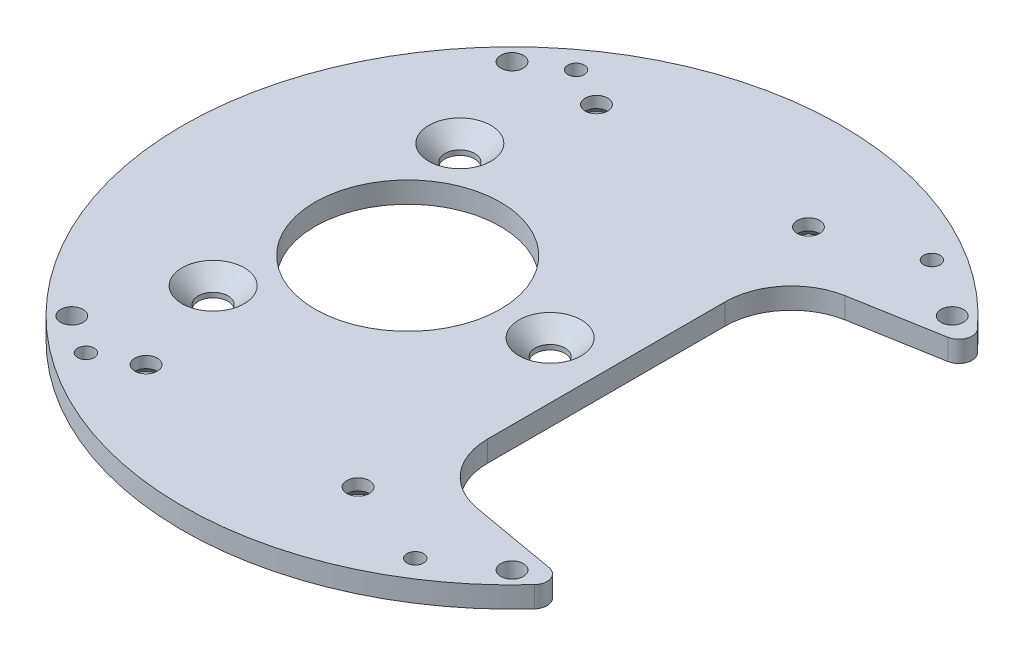
ISO-10303-21;
HEADER;
FILE_DESCRIPTION(('STEP AP214'),'2;1');
FILE_NAME('part.step','',(''),(''),'','','');
FILE_SCHEMA(('AUTOMOTIVE_DESIGN { 1 0 10303 214 1 1 1 1 }'));
ENDSEC;
DATA;
#1=APPLICATION_CONTEXT('core data for automotive mechanical design processes');
#2=APPLICATION_PROTOCOL_DEFINITION('international standard','automotive_design',2000,#1);
#3=PRODUCT_CONTEXT('',#1,'mechanical');
#4=PRODUCT('Part','Part','',(#3));
#5=PRODUCT_RELATED_PRODUCT_CATEGORY('part','',(#4));
#6=PRODUCT_DEFINITION_FORMATION('','',#4);
#7=PRODUCT_DEFINITION_CONTEXT('part definition',#1,'design');
#8=PRODUCT_DEFINITION('design','',#6,#7);
#9=PRODUCT_DEFINITION_SHAPE('','',#8);
#10=(LENGTH_UNIT() NAMED_UNIT(*) SI_UNIT(.MILLI.,.METRE.));
#11=(NAMED_UNIT(*) PLANE_ANGLE_UNIT() SI_UNIT($,.RADIAN.));
#12=(NAMED_UNIT(*) SI_UNIT($,.STERADIAN.) SOLID_ANGLE_UNIT());
#13=UNCERTAINTY_MEASURE_WITH_UNIT(LENGTH_MEASURE(1.E-05),#10,'distance_accuracy_value','');
#14=(GEOMETRIC_REPRESENTATION_CONTEXT(3) GLOBAL_UNCERTAINTY_ASSIGNED_CONTEXT((#13)) GLOBAL_UNIT_ASSIGNED_CONTEXT((#10,
#11,#12)) REPRESENTATION_CONTEXT('',''));
#15=CARTESIAN_POINT('',(0.,0.,0.));
#16=DIRECTION('',(0.,0.,1.));
#17=DIRECTION('',(1.,0.,0.));
#18=AXIS2_PLACEMENT_3D('',#15,#16,#17);
#19=CARTESIAN_POINT('',(0.,3.17499999999998,0.));
#20=DIRECTION('',(0.,1.,0.));
#21=DIRECTION('',(0.,0.,1.));
#22=AXIS2_PLACEMENT_3D('',#19,#20,#21);
#23=PLANE('',#22);
#24=CARTESIAN_POINT('',(-27.3313007374329,3.17499999999998,37.));
#25=DIRECTION('',(0.,1.,0.));
#26=DIRECTION('',(0.,0.,1.));
#27=AXIS2_PLACEMENT_3D('',#24,#25,#26);
#28=CIRCLE('',#27,1.24999999999999);
#29=CARTESIAN_POINT('',(-27.3313007374329,3.17499999999998,38.25));
#30=VERTEX_POINT('',#29);
#31=EDGE_CURVE('E354',#30,#30,#28,.T.);
#32=ORIENTED_EDGE('',*,*,#31,.F.);
#33=EDGE_LOOP('',(#32));
#34=FACE_BOUND('',#33,.T.);
#35=CARTESIAN_POINT('',(24.3926218353009,3.17499999999998,39.));
#36=DIRECTION('',(0.,1.,0.));
#37=DIRECTION('',(0.,0.,1.));
#38=AXIS2_PLACEMENT_3D('',#35,#36,#37);
#39=CIRCLE('',#38,1.24999999999999);
#40=CARTESIAN_POINT('',(24.3926218353009,3.17499999999998,40.25));
#41=VERTEX_POINT('',#40);
#42=EDGE_CURVE('E350',#41,#41,#39,.T.);
#43=ORIENTED_EDGE('',*,*,#42,.F.);
#44=EDGE_LOOP('',(#43));
#45=FACE_BOUND('',#44,.T.);
#46=CARTESIAN_POINT('',(24.3926218353009,3.17500000000004,-39.));
#47=DIRECTION('',(0.,1.,0.));
#48=DIRECTION('',(0.,0.,1.));
#49=AXIS2_PLACEMENT_3D('',#46,#47,#48);
#50=CIRCLE('',#49,1.24999999999999);
#51=CARTESIAN_POINT('',(24.3926218353009,3.17500000000004,-37.7500000000001));
#52=VERTEX_POINT('',#51);
#53=EDGE_CURVE('E346',#52,#52,#50,.T.);
#54=ORIENTED_EDGE('',*,*,#53,.F.);
#55=EDGE_LOOP('',(#54));
#56=FACE_BOUND('',#55,.T.);
#57=CARTESIAN_POINT('',(-27.3313007374329,3.17499999999998,-37.));
#58=DIRECTION('',(0.,1.,0.));
#59=DIRECTION('',(0.,0.,1.));
#60=AXIS2_PLACEMENT_3D('',#57,#58,#59);
#61=CIRCLE('',#60,1.24999999999999);
#62=CARTESIAN_POINT('',(-27.3313007374329,3.17499999999998,-35.75));
#63=VERTEX_POINT('',#62);
#64=EDGE_CURVE('E342',#63,#63,#61,.T.);
#65=ORIENTED_EDGE('',*,*,#64,.F.);
#66=EDGE_LOOP('',(#65));
#67=FACE_BOUND('',#66,.T.);
#68=CARTESIAN_POINT('',(-21.25,3.17499999999998,34.));
#69=DIRECTION('',(0.,-1.,0.));
#70=DIRECTION('',(0.,0.,-1.));
#71=AXIS2_PLACEMENT_3D('',#68,#69,#70);
#72=CIRCLE('',#71,1.7);
#73=CARTESIAN_POINT('',(-21.25,3.17499999999998,32.3));
#74=VERTEX_POINT('',#73);
#75=EDGE_CURVE('E334',#74,#74,#72,.T.);
#76=ORIENTED_EDGE('',*,*,#75,.T.);
#77=EDGE_LOOP('',(#76));
#78=FACE_BOUND('',#77,.T.);
#79=CARTESIAN_POINT('',(10.75,3.17499999999998,34.));
#80=DIRECTION('',(0.,-1.,0.));
#81=DIRECTION('',(0.,0.,-1.));
#82=AXIS2_PLACEMENT_3D('',#79,#80,#81);
#83=CIRCLE('',#82,1.7);
#84=CARTESIAN_POINT('',(10.75,3.17499999999998,32.3));
#85=VERTEX_POINT('',#84);
#86=EDGE_CURVE('E327',#85,#85,#83,.T.);
#87=ORIENTED_EDGE('',*,*,#86,.T.);
#88=EDGE_LOOP('',(#87));
#89=FACE_BOUND('',#88,.T.);
#90=CARTESIAN_POINT('',(10.75,3.17499999999998,-34.));
#91=DIRECTION('',(0.,-1.,0.));
#92=DIRECTION('',(0.,0.,-1.));
#93=AXIS2_PLACEMENT_3D('',#90,#91,#92);
#94=CIRCLE('',#93,1.7);
#95=CARTESIAN_POINT('',(10.75,3.17499999999998,-35.7));
#96=VERTEX_POINT('',#95);
#97=EDGE_CURVE('E320',#96,#96,#94,.T.);
#98=ORIENTED_EDGE('',*,*,#97,.T.);
#99=EDGE_LOOP('',(#98));
#100=FACE_BOUND('',#99,.T.);
#101=CARTESIAN_POINT('',(-21.25,3.17499999999998,-34.));
#102=DIRECTION('',(0.,-1.,0.));
#103=DIRECTION('',(0.,0.,-1.));
#104=AXIS2_PLACEMENT_3D('',#101,#102,#103);
#105=CIRCLE('',#104,1.7);
#106=CARTESIAN_POINT('',(-21.25,3.17499999999998,-35.7));
#107=VERTEX_POINT('',#106);
#108=EDGE_CURVE('E313',#107,#107,#105,.T.);
#109=ORIENTED_EDGE('',*,*,#108,.T.);
#110=EDGE_LOOP('',(#109));
#111=FACE_BOUND('',#110,.T.);
#112=CARTESIAN_POINT('',(33.2269476479563,3.17499999999998,33.2269476479555));
#113=DIRECTION('',(0.,-1.,0.));
#114=DIRECTION('',(0.,0.,-1.));
#115=AXIS2_PLACEMENT_3D('',#112,#113,#114);
#116=CIRCLE('',#115,1.7);
#117=CARTESIAN_POINT('',(33.2269476479563,3.17499999999998,31.5269476479555));
#118=VERTEX_POINT('',#117);
#119=EDGE_CURVE('E309',#118,#118,#116,.T.);
#120=ORIENTED_EDGE('',*,*,#119,.T.);
#121=EDGE_LOOP('',(#120));
#122=FACE_BOUND('',#121,.T.);
#123=CARTESIAN_POINT('',(0.,3.17499999999998,0.));
#124=DIRECTION('',(0.,1.,0.));
#125=DIRECTION('',(0.,0.,1.));
#126=AXIS2_PLACEMENT_3D('',#123,#124,#125);
#127=CIRCLE('',#126,49.75);
#128=CARTESIAN_POINT('',(36.8488126440813,3.17500000000004,-33.4249533540647));
#129=VERTEX_POINT('',#128);
#130=CARTESIAN_POINT('',(36.8488126440813,3.17499999999998,33.4249533540646));
#131=VERTEX_POINT('',#130);
#132=EDGE_CURVE('E108',#129,#131,#127,.T.);
#133=ORIENTED_EDGE('',*,*,#132,.T.);
#134=CARTESIAN_POINT('',(35.3674533418067,3.17499999999998,32.0812366363133));
#135=DIRECTION('',(0.,1.,0.));
#136=DIRECTION('',(0.,0.,1.));
#137=AXIS2_PLACEMENT_3D('',#134,#135,#136);
#138=CIRCLE('',#137,2.);
#139=CARTESIAN_POINT('',(35.7147496971405,3.17500000000004,30.1116211302889));
#140=VERTEX_POINT('',#139);
#141=EDGE_CURVE('E130',#131,#140,#138,.T.);
#142=ORIENTED_EDGE('',*,*,#141,.T.);
#143=DIRECTION('',(0.984807753012208,0.,0.173648177666933));
#144=VECTOR('',#143,1.);
#145=CARTESIAN_POINT('',(-4.07245901061396,3.17500000000004,23.0960627480329));
#146=LINE('',#145,#144);
#147=CARTESIAN_POINT('',(22.5135182233307,3.17500000000004,27.7838878428784));
#148=VERTEX_POINT('',#147);
#149=EDGE_CURVE('E154',#148,#140,#146,.T.);
#150=ORIENTED_EDGE('',*,*,#149,.F.);
#151=CARTESIAN_POINT('',(24.25,3.17499999999998,17.9358103127563));
#152=DIRECTION('',(0.,1.,0.));
#153=DIRECTION('',(0.,0.,1.));
#154=AXIS2_PLACEMENT_3D('',#151,#152,#153);
#155=CIRCLE('',#154,10.);
#156=CARTESIAN_POINT('',(14.25,3.17499999999993,17.9358103127563));
#157=VERTEX_POINT('',#156);
#158=EDGE_CURVE('E44',#148,#157,#155,.F.);
#159=ORIENTED_EDGE('',*,*,#158,.T.);
#160=DIRECTION('',(0.,0.,1.));
#161=VECTOR('',#160,1.);
#162=CARTESIAN_POINT('',(14.25,3.17499999999998,0.));
#163=LINE('',#162,#161);
#164=CARTESIAN_POINT('',(14.25,3.17499999999998,-17.9358103127563));
#165=VERTEX_POINT('',#164);
#166=EDGE_CURVE('E152',#165,#157,#163,.T.);
#167=ORIENTED_EDGE('',*,*,#166,.F.);
#168=CARTESIAN_POINT('',(24.25,3.17499999999998,-17.9358103127563));
#169=DIRECTION('',(0.,1.,0.));
#170=DIRECTION('',(0.,0.,1.));
#171=AXIS2_PLACEMENT_3D('',#168,#169,#170);
#172=CIRCLE('',#171,10.);
#173=CARTESIAN_POINT('',(22.5135182233307,3.17499999999998,-27.7838878428784));
#174=VERTEX_POINT('',#173);
#175=EDGE_CURVE('E144',#165,#174,#172,.F.);
#176=ORIENTED_EDGE('',*,*,#175,.T.);
#177=DIRECTION('',(0.984807753012208,0.,-0.173648177666934));
#178=VECTOR('',#177,1.);
#179=CARTESIAN_POINT('',(-4.07245901061397,3.17499999999998,-23.0960627480329));
#180=LINE('',#179,#178);
#181=CARTESIAN_POINT('',(35.7147496971405,3.17499999999998,-30.1116211302889));
#182=VERTEX_POINT('',#181);
#183=EDGE_CURVE('E168',#174,#182,#180,.T.);
#184=ORIENTED_EDGE('',*,*,#183,.T.);
#185=CARTESIAN_POINT('',(35.3674533418066,3.17500000000004,-32.0812366363133));
#186=DIRECTION('',(0.,1.,0.));
#187=DIRECTION('',(0.,0.,1.));
#188=AXIS2_PLACEMENT_3D('',#185,#186,#187);
#189=CIRCLE('',#188,2.);
#190=EDGE_CURVE('E176',#182,#129,#189,.T.);
#191=ORIENTED_EDGE('',*,*,#190,.T.);
#192=EDGE_LOOP('',(#133,#142,#150,#159,#167,#176,#184,#191));
#193=FACE_BOUND('',#192,.T.);
#194=CARTESIAN_POINT('',(-15.75,3.17499999999998,0.));
#195=DIRECTION('',(0.,1.,0.));
#196=DIRECTION('',(0.,0.,1.));
#197=AXIS2_PLACEMENT_3D('',#194,#195,#196);
#198=CIRCLE('',#197,14.);
#199=CARTESIAN_POINT('',(-15.75,3.17499999999998,14.));
#200=VERTEX_POINT('',#199);
#201=EDGE_CURVE('E272',#200,#200,#198,.T.);
#202=ORIENTED_EDGE('',*,*,#201,.F.);
#203=EDGE_LOOP('',(#202));
#204=FACE_BOUND('',#203,.T.);
#205=CARTESIAN_POINT('',(5.75,3.17499999999998,0.));
#206=DIRECTION('',(0.,1.,0.));
#207=DIRECTION('',(0.,0.,1.));
#208=AXIS2_PLACEMENT_3D('',#205,#206,#207);
#209=CIRCLE('',#208,4.7);
#210=CARTESIAN_POINT('',(5.75,3.17499999999998,4.7));
#211=VERTEX_POINT('',#210);
#212=EDGE_CURVE('E280',#211,#211,#209,.T.);
#213=ORIENTED_EDGE('',*,*,#212,.F.);
#214=EDGE_LOOP('',(#213));
#215=FACE_BOUND('',#214,.T.);
#216=CARTESIAN_POINT('',(-26.5000000000001,3.17500000000004,-18.6195461813654));
#217=DIRECTION('',(0.,1.,0.));
#218=DIRECTION('',(0.,0.,1.));
#219=AXIS2_PLACEMENT_3D('',#216,#217,#218);
#220=CIRCLE('',#219,4.7);
#221=CARTESIAN_POINT('',(-26.5000000000001,3.17500000000004,-13.9195461813654));
#222=VERTEX_POINT('',#221);
#223=EDGE_CURVE('E287',#222,#222,#220,.T.);
#224=ORIENTED_EDGE('',*,*,#223,.F.);
#225=EDGE_LOOP('',(#224));
#226=FACE_BOUND('',#225,.T.);
#227=CARTESIAN_POINT('',(-26.4999999999999,3.17500000000004,18.6195461813655));
#228=DIRECTION('',(0.,1.,0.));
#229=DIRECTION('',(0.,0.,1.));
#230=AXIS2_PLACEMENT_3D('',#227,#228,#229);
#231=CIRCLE('',#230,4.7);
#232=CARTESIAN_POINT('',(-26.4999999999999,3.17500000000004,23.3195461813655));
#233=VERTEX_POINT('',#232);
#234=EDGE_CURVE('E294',#233,#233,#231,.T.);
#235=ORIENTED_EDGE('',*,*,#234,.F.);
#236=EDGE_LOOP('',(#235));
#237=FACE_BOUND('',#236,.T.);
#238=CARTESIAN_POINT('',(33.2269476479558,3.17500000000004,-33.226947647956));
#239=DIRECTION('',(0.,-1.,0.));
#240=DIRECTION('',(0.,0.,-1.));
#241=AXIS2_PLACEMENT_3D('',#238,#239,#240);
#242=CIRCLE('',#241,1.7);
#243=CARTESIAN_POINT('',(33.2269476479558,3.17500000000004,-34.926947647956));
#244=VERTEX_POINT('',#243);
#245=EDGE_CURVE('E297',#244,#244,#242,.T.);
#246=ORIENTED_EDGE('',*,*,#245,.T.);
#247=EDGE_LOOP('',(#246));
#248=FACE_BOUND('',#247,.T.);
#249=CARTESIAN_POINT('',(-33.2269476479561,3.17499999999998,-33.2269476479557));
#250=DIRECTION('',(0.,-1.,0.));
#251=DIRECTION('',(0.,0.,-1.));
#252=AXIS2_PLACEMENT_3D('',#249,#250,#251);
#253=CIRCLE('',#252,1.7);
#254=CARTESIAN_POINT('',(-33.2269476479561,3.17499999999998,-34.9269476479557));
#255=VERTEX_POINT('',#254);
#256=EDGE_CURVE('E301',#255,#255,#253,.T.);
#257=ORIENTED_EDGE('',*,*,#256,.T.);
#258=EDGE_LOOP('',(#257));
#259=FACE_BOUND('',#258,.T.);
#260=CARTESIAN_POINT('',(-33.2269476479559,3.17499999999998,33.2269476479559));
#261=DIRECTION('',(0.,-1.,0.));
#262=DIRECTION('',(0.,0.,-1.));
#263=AXIS2_PLACEMENT_3D('',#260,#261,#262);
#264=CIRCLE('',#263,1.7);
#265=CARTESIAN_POINT('',(-33.2269476479559,3.17499999999998,31.5269476479559));
#266=VERTEX_POINT('',#265);
#267=EDGE_CURVE('E305',#266,#266,#264,.T.);
#268=ORIENTED_EDGE('',*,*,#267,.T.);
#269=EDGE_LOOP('',(#268));
#270=FACE_BOUND('',#269,.T.);
#271=ADVANCED_FACE('F36',(#34,#45,#56,#67,#78,#89,#100,#111,#122,#193,#204,#215,#226,#237,#248,
#259,#270),#23,.T.);
#272=CARTESIAN_POINT('',(0.,3.17499999999998,0.));
#273=DIRECTION('',(0.,-1.,0.));
#274=DIRECTION('',(0.,0.,-1.));
#275=AXIS2_PLACEMENT_3D('',#272,#273,#274);
#276=CYLINDRICAL_SURFACE('',#275,49.75);
#277=CARTESIAN_POINT('',(0.,0.,0.));
#278=DIRECTION('',(0.,1.,0.));
#279=DIRECTION('',(0.,0.,1.));
#280=AXIS2_PLACEMENT_3D('',#277,#278,#279);
#281=CIRCLE('',#280,49.75);
#282=CARTESIAN_POINT('',(36.8488126440813,0.,-33.4249533540647));
#283=VERTEX_POINT('',#282);
#284=CARTESIAN_POINT('',(36.8488126440813,0.,33.4249533540646));
#285=VERTEX_POINT('',#284);
#286=EDGE_CURVE('E105',#283,#285,#281,.T.);
#287=ORIENTED_EDGE('',*,*,#286,.T.);
#288=DIRECTION('',(0.,-1.,0.));
#289=VECTOR('',#288,1.);
#290=CARTESIAN_POINT('',(36.8488126440813,3.17499999999998,33.4249533540646));
#291=LINE('',#290,#289);
#292=EDGE_CURVE('E112',#285,#131,#291,.F.);
#293=ORIENTED_EDGE('',*,*,#292,.T.);
#294=ORIENTED_EDGE('',*,*,#132,.F.);
#295=DIRECTION('',(0.,-1.,0.));
#296=VECTOR('',#295,1.);
#297=CARTESIAN_POINT('',(36.8488126440813,3.17500000000004,-33.4249533540647));
#298=LINE('',#297,#296);
#299=EDGE_CURVE('E101',#129,#283,#298,.T.);
#300=ORIENTED_EDGE('',*,*,#299,.T.);
#301=EDGE_LOOP('',(#287,#293,#294,#300));
#302=FACE_BOUND('',#301,.T.);
#303=ADVANCED_FACE('F103',(#302),#276,.T.);
#304=CARTESIAN_POINT('',(0.,0.,0.));
#305=DIRECTION('',(0.,1.,0.));
#306=DIRECTION('',(0.,0.,1.));
#307=AXIS2_PLACEMENT_3D('',#304,#305,#306);
#308=PLANE('',#307);
#309=CARTESIAN_POINT('',(-27.3313007374329,0.,37.));
#310=DIRECTION('',(0.,1.,0.));
#311=DIRECTION('',(0.,0.,1.));
#312=AXIS2_PLACEMENT_3D('',#309,#310,#311);
#313=CIRCLE('',#312,1.25);
#314=CARTESIAN_POINT('',(-27.3313007374329,0.,38.25));
#315=VERTEX_POINT('',#314);
#316=EDGE_CURVE('E212',#315,#315,#313,.T.);
#317=ORIENTED_EDGE('',*,*,#316,.T.);
#318=EDGE_LOOP('',(#317));
#319=FACE_BOUND('',#318,.T.);
#320=CARTESIAN_POINT('',(24.3926218353009,0.,39.));
#321=DIRECTION('',(0.,1.,0.));
#322=DIRECTION('',(0.,0.,1.));
#323=AXIS2_PLACEMENT_3D('',#320,#321,#322);
#324=CIRCLE('',#323,1.25);
#325=CARTESIAN_POINT('',(24.3926218353009,0.,40.25));
#326=VERTEX_POINT('',#325);
#327=EDGE_CURVE('E216',#326,#326,#324,.T.);
#328=ORIENTED_EDGE('',*,*,#327,.T.);
#329=EDGE_LOOP('',(#328));
#330=FACE_BOUND('',#329,.T.);
#331=CARTESIAN_POINT('',(24.3926218353009,0.,-39.));
#332=DIRECTION('',(0.,1.,0.));
#333=DIRECTION('',(0.,0.,1.));
#334=AXIS2_PLACEMENT_3D('',#331,#332,#333);
#335=CIRCLE('',#334,1.25);
#336=CARTESIAN_POINT('',(24.3926218353009,0.,-37.75));
#337=VERTEX_POINT('',#336);
#338=EDGE_CURVE('E220',#337,#337,#335,.T.);
#339=ORIENTED_EDGE('',*,*,#338,.T.);
#340=EDGE_LOOP('',(#339));
#341=FACE_BOUND('',#340,.T.);
#342=CARTESIAN_POINT('',(-27.3313007374329,0.,-37.));
#343=DIRECTION('',(0.,1.,0.));
#344=DIRECTION('',(0.,0.,1.));
#345=AXIS2_PLACEMENT_3D('',#342,#343,#344);
#346=CIRCLE('',#345,1.25);
#347=CARTESIAN_POINT('',(-27.3313007374329,0.,-35.75));
#348=VERTEX_POINT('',#347);
#349=EDGE_CURVE('E224',#348,#348,#346,.T.);
#350=ORIENTED_EDGE('',*,*,#349,.T.);
#351=EDGE_LOOP('',(#350));
#352=FACE_BOUND('',#351,.T.);
#353=CARTESIAN_POINT('',(-21.25,0.,34.));
#354=DIRECTION('',(0.,-1.,0.));
#355=DIRECTION('',(0.,0.,-1.));
#356=AXIS2_PLACEMENT_3D('',#353,#354,#355);
#357=CIRCLE('',#356,3.15);
#358=CARTESIAN_POINT('',(-21.25,0.,30.85));
#359=VERTEX_POINT('',#358);
#360=EDGE_CURVE('E228',#359,#359,#357,.T.);
#361=ORIENTED_EDGE('',*,*,#360,.F.);
#362=EDGE_LOOP('',(#361));
#363=FACE_BOUND('',#362,.T.);
#364=CARTESIAN_POINT('',(10.75,0.,34.));
#365=DIRECTION('',(0.,-1.,0.));
#366=DIRECTION('',(0.,0.,-1.));
#367=AXIS2_PLACEMENT_3D('',#364,#365,#366);
#368=CIRCLE('',#367,3.15);
#369=CARTESIAN_POINT('',(10.75,0.,30.85));
#370=VERTEX_POINT('',#369);
#371=EDGE_CURVE('E232',#370,#370,#368,.T.);
#372=ORIENTED_EDGE('',*,*,#371,.F.);
#373=EDGE_LOOP('',(#372));
#374=FACE_BOUND('',#373,.T.);
#375=CARTESIAN_POINT('',(10.75,0.,-34.));
#376=DIRECTION('',(0.,-1.,0.));
#377=DIRECTION('',(0.,0.,-1.));
#378=AXIS2_PLACEMENT_3D('',#375,#376,#377);
#379=CIRCLE('',#378,3.15);
#380=CARTESIAN_POINT('',(10.75,0.,-37.15));
#381=VERTEX_POINT('',#380);
#382=EDGE_CURVE('E236',#381,#381,#379,.T.);
#383=ORIENTED_EDGE('',*,*,#382,.F.);
#384=EDGE_LOOP('',(#383));
#385=FACE_BOUND('',#384,.T.);
#386=CARTESIAN_POINT('',(-21.25,0.,-34.));
#387=DIRECTION('',(0.,-1.,0.));
#388=DIRECTION('',(0.,0.,-1.));
#389=AXIS2_PLACEMENT_3D('',#386,#387,#388);
#390=CIRCLE('',#389,3.15);
#391=CARTESIAN_POINT('',(-21.25,0.,-37.15));
#392=VERTEX_POINT('',#391);
#393=EDGE_CURVE('E240',#392,#392,#390,.T.);
#394=ORIENTED_EDGE('',*,*,#393,.F.);
#395=EDGE_LOOP('',(#394));
#396=FACE_BOUND('',#395,.T.);
#397=CARTESIAN_POINT('',(33.2269476479563,0.,33.2269476479555));
#398=DIRECTION('',(0.,-1.,0.));
#399=DIRECTION('',(0.,0.,-1.));
#400=AXIS2_PLACEMENT_3D('',#397,#398,#399);
#401=CIRCLE('',#400,1.7);
#402=CARTESIAN_POINT('',(33.2269476479563,0.,31.5269476479555));
#403=VERTEX_POINT('',#402);
#404=EDGE_CURVE('E244',#403,#403,#401,.T.);
#405=ORIENTED_EDGE('',*,*,#404,.F.);
#406=EDGE_LOOP('',(#405));
#407=FACE_BOUND('',#406,.T.);
#408=CARTESIAN_POINT('',(-33.2269476479558,0.,33.226947647956));
#409=DIRECTION('',(0.,-1.,0.));
#410=DIRECTION('',(0.,0.,-1.));
#411=AXIS2_PLACEMENT_3D('',#408,#409,#410);
#412=CIRCLE('',#411,1.7);
#413=CARTESIAN_POINT('',(-33.2269476479558,0.,31.526947647956));
#414=VERTEX_POINT('',#413);
#415=EDGE_CURVE('E248',#414,#414,#412,.T.);
#416=ORIENTED_EDGE('',*,*,#415,.F.);
#417=EDGE_LOOP('',(#416));
#418=FACE_BOUND('',#417,.T.);
#419=CARTESIAN_POINT('',(-33.2269476479561,0.,-33.2269476479557));
#420=DIRECTION('',(0.,-1.,0.));
#421=DIRECTION('',(0.,0.,-1.));
#422=AXIS2_PLACEMENT_3D('',#419,#420,#421);
#423=CIRCLE('',#422,1.7);
#424=CARTESIAN_POINT('',(-33.2269476479561,0.,-34.9269476479557));
#425=VERTEX_POINT('',#424);
#426=EDGE_CURVE('E252',#425,#425,#423,.T.);
#427=ORIENTED_EDGE('',*,*,#426,.F.);
#428=EDGE_LOOP('',(#427));
#429=FACE_BOUND('',#428,.T.);
#430=CARTESIAN_POINT('',(33.2269476479558,0.,-33.226947647956));
#431=DIRECTION('',(0.,-1.,0.));
#432=DIRECTION('',(0.,0.,-1.));
#433=AXIS2_PLACEMENT_3D('',#430,#431,#432);
#434=CIRCLE('',#433,1.7);
#435=CARTESIAN_POINT('',(33.2269476479558,0.,-34.926947647956));
#436=VERTEX_POINT('',#435);
#437=EDGE_CURVE('E256',#436,#436,#434,.T.);
#438=ORIENTED_EDGE('',*,*,#437,.F.);
#439=EDGE_LOOP('',(#438));
#440=FACE_BOUND('',#439,.T.);
#441=CARTESIAN_POINT('',(-26.4999999999999,0.,18.6195461813655));
#442=DIRECTION('',(0.,1.,0.));
#443=DIRECTION('',(0.,0.,1.));
#444=AXIS2_PLACEMENT_3D('',#441,#442,#443);
#445=CIRCLE('',#444,2.25);
#446=CARTESIAN_POINT('',(-26.4999999999999,0.,20.8695461813655));
#447=VERTEX_POINT('',#446);
#448=EDGE_CURVE('E260',#447,#447,#445,.T.);
#449=ORIENTED_EDGE('',*,*,#448,.T.);
#450=EDGE_LOOP('',(#449));
#451=FACE_BOUND('',#450,.T.);
#452=CARTESIAN_POINT('',(-26.5000000000001,0.,-18.6195461813654));
#453=DIRECTION('',(0.,1.,0.));
#454=DIRECTION('',(0.,0.,1.));
#455=AXIS2_PLACEMENT_3D('',#452,#453,#454);
#456=CIRCLE('',#455,2.25);
#457=CARTESIAN_POINT('',(-26.5000000000001,0.,-16.3695461813654));
#458=VERTEX_POINT('',#457);
#459=EDGE_CURVE('E264',#458,#458,#456,.T.);
#460=ORIENTED_EDGE('',*,*,#459,.T.);
#461=EDGE_LOOP('',(#460));
#462=FACE_BOUND('',#461,.T.);
#463=CARTESIAN_POINT('',(5.75,0.,0.));
#464=DIRECTION('',(0.,1.,0.));
#465=DIRECTION('',(0.,0.,1.));
#466=AXIS2_PLACEMENT_3D('',#463,#464,#465);
#467=CIRCLE('',#466,2.25);
#468=CARTESIAN_POINT('',(5.75,0.,2.25));
#469=VERTEX_POINT('',#468);
#470=EDGE_CURVE('E268',#469,#469,#467,.T.);
#471=ORIENTED_EDGE('',*,*,#470,.T.);
#472=EDGE_LOOP('',(#471));
#473=FACE_BOUND('',#472,.T.);
#474=CARTESIAN_POINT('',(-15.75,0.,0.));
#475=DIRECTION('',(0.,1.,0.));
#476=DIRECTION('',(0.,0.,1.));
#477=AXIS2_PLACEMENT_3D('',#474,#475,#476);
#478=CIRCLE('',#477,14.);
#479=CARTESIAN_POINT('',(-15.75,0.,14.));
#480=VERTEX_POINT('',#479);
#481=EDGE_CURVE('E159',#480,#480,#478,.T.);
#482=ORIENTED_EDGE('',*,*,#481,.T.);
#483=EDGE_LOOP('',(#482));
#484=FACE_BOUND('',#483,.T.);
#485=DIRECTION('',(0.,0.,1.));
#486=VECTOR('',#485,1.);
#487=CARTESIAN_POINT('',(14.25,0.,0.));
#488=LINE('',#487,#486);
#489=CARTESIAN_POINT('',(14.25,0.,-17.9358103127563));
#490=VERTEX_POINT('',#489);
#491=CARTESIAN_POINT('',(14.25,0.,17.9358103127563));
#492=VERTEX_POINT('',#491);
#493=EDGE_CURVE('E165',#490,#492,#488,.T.);
#494=ORIENTED_EDGE('',*,*,#493,.T.);
#495=CARTESIAN_POINT('',(24.25,0.,17.9358103127563));
#496=DIRECTION('',(0.,1.,0.));
#497=DIRECTION('',(0.,0.,1.));
#498=AXIS2_PLACEMENT_3D('',#495,#496,#497);
#499=CIRCLE('',#498,10.);
#500=CARTESIAN_POINT('',(22.5135182233307,0.,27.7838878428784));
#501=VERTEX_POINT('',#500);
#502=EDGE_CURVE('E11',#492,#501,#499,.T.);
#503=ORIENTED_EDGE('',*,*,#502,.T.);
#504=DIRECTION('',(0.984807753012208,0.,0.173648177666933));
#505=VECTOR('',#504,1.);
#506=CARTESIAN_POINT('',(-4.07245901061396,0.,23.0960627480329));
#507=LINE('',#506,#505);
#508=CARTESIAN_POINT('',(35.7147496971405,0.,30.1116211302889));
#509=VERTEX_POINT('',#508);
#510=EDGE_CURVE('E163',#501,#509,#507,.T.);
#511=ORIENTED_EDGE('',*,*,#510,.T.);
#512=CARTESIAN_POINT('',(35.3674533418067,0.,32.0812366363133));
#513=DIRECTION('',(0.,1.,0.));
#514=DIRECTION('',(0.,0.,1.));
#515=AXIS2_PLACEMENT_3D('',#512,#513,#514);
#516=CIRCLE('',#515,2.);
#517=EDGE_CURVE('E120',#509,#285,#516,.F.);
#518=ORIENTED_EDGE('',*,*,#517,.T.);
#519=ORIENTED_EDGE('',*,*,#286,.F.);
#520=CARTESIAN_POINT('',(35.3674533418066,0.,-32.0812366363133));
#521=DIRECTION('',(0.,1.,0.));
#522=DIRECTION('',(0.,0.,1.));
#523=AXIS2_PLACEMENT_3D('',#520,#521,#522);
#524=CIRCLE('',#523,2.);
#525=CARTESIAN_POINT('',(35.7147496971405,0.,-30.1116211302889));
#526=VERTEX_POINT('',#525);
#527=EDGE_CURVE('E117',#283,#526,#524,.F.);
#528=ORIENTED_EDGE('',*,*,#527,.T.);
#529=DIRECTION('',(0.984807753012208,0.,-0.173648177666934));
#530=VECTOR('',#529,1.);
#531=CARTESIAN_POINT('',(-4.07245901061397,0.,-23.0960627480329));
#532=LINE('',#531,#530);
#533=CARTESIAN_POINT('',(22.5135182233307,0.,-27.7838878428784));
#534=VERTEX_POINT('',#533);
#535=EDGE_CURVE('E121',#534,#526,#532,.T.);
#536=ORIENTED_EDGE('',*,*,#535,.F.);
#537=CARTESIAN_POINT('',(24.25,0.,-17.9358103127564));
#538=DIRECTION('',(0.,1.,0.));
#539=DIRECTION('',(0.,0.,1.));
#540=AXIS2_PLACEMENT_3D('',#537,#538,#539);
#541=CIRCLE('',#540,10.);
#542=EDGE_CURVE('E146',#534,#490,#541,.T.);
#543=ORIENTED_EDGE('',*,*,#542,.T.);
#544=EDGE_LOOP('',(#494,#503,#511,#518,#519,#528,#536,#543));
#545=FACE_BOUND('',#544,.T.);
#546=ADVANCED_FACE('F115',(#319,#330,#341,#352,#363,#374,#385,#396,#407,#418,#429,#440,#451,
#462,#473,#484,#545),#308,.F.);
#547=CARTESIAN_POINT('',(14.25,0.,0.));
#548=DIRECTION('',(-1.,0.,0.));
#549=DIRECTION('',(0.,0.,1.));
#550=AXIS2_PLACEMENT_3D('',#547,#548,#549);
#551=PLANE('',#550);
#552=ORIENTED_EDGE('',*,*,#493,.F.);
#553=DIRECTION('',(0.,1.,0.));
#554=VECTOR('',#553,1.);
#555=CARTESIAN_POINT('',(14.25,0.,-17.9358103127563));
#556=LINE('',#555,#554);
#557=EDGE_CURVE('E137',#490,#165,#556,.T.);
#558=ORIENTED_EDGE('',*,*,#557,.T.);
#559=ORIENTED_EDGE('',*,*,#166,.T.);
#560=DIRECTION('',(0.,1.,0.));
#561=VECTOR('',#560,1.);
#562=CARTESIAN_POINT('',(14.25,0.,17.9358103127563));
#563=LINE('',#562,#561);
#564=EDGE_CURVE('E135',#157,#492,#563,.F.);
#565=ORIENTED_EDGE('',*,*,#564,.T.);
#566=EDGE_LOOP('',(#552,#558,#559,#565));
#567=FACE_BOUND('',#566,.T.);
#568=ADVANCED_FACE('F157',(#567),#551,.F.);
#569=CARTESIAN_POINT('',(-4.07245901061397,0.,-23.0960627480329));
#570=DIRECTION('',(0.173648177666934,0.,0.984807753012207));
#571=DIRECTION('',(0.984807753012207,0.,-0.173648177666934));
#572=AXIS2_PLACEMENT_3D('',#569,#570,#571);
#573=PLANE('',#572);
#574=ORIENTED_EDGE('',*,*,#183,.F.);
#575=DIRECTION('',(0.,1.,0.));
#576=VECTOR('',#575,1.);
#577=CARTESIAN_POINT('',(22.5135182233307,0.,-27.7838878428784));
#578=LINE('',#577,#576);
#579=EDGE_CURVE('E140',#174,#534,#578,.F.);
#580=ORIENTED_EDGE('',*,*,#579,.T.);
#581=ORIENTED_EDGE('',*,*,#535,.T.);
#582=DIRECTION('',(0.,1.,0.));
#583=VECTOR('',#582,1.);
#584=CARTESIAN_POINT('',(35.7147496971405,3.17499999999998,-30.1116211302889));
#585=LINE('',#584,#583);
#586=EDGE_CURVE('E125',#526,#182,#585,.T.);
#587=ORIENTED_EDGE('',*,*,#586,.T.);
#588=EDGE_LOOP('',(#574,#580,#581,#587));
#589=FACE_BOUND('',#588,.T.);
#590=ADVANCED_FACE('F208',(#589),#573,.T.);
#591=CARTESIAN_POINT('',(-4.07245901061396,0.,23.0960627480329));
#592=DIRECTION('',(-0.173648177666933,0.,0.984807753012207));
#593=DIRECTION('',(0.984807753012208,0.,0.173648177666933));
#594=AXIS2_PLACEMENT_3D('',#591,#592,#593);
#595=PLANE('',#594);
#596=ORIENTED_EDGE('',*,*,#510,.F.);
#597=DIRECTION('',(0.,1.,0.));
#598=VECTOR('',#597,1.);
#599=CARTESIAN_POINT('',(22.5135182233307,3.17500000000004,27.7838878428784));
#600=LINE('',#599,#598);
#601=EDGE_CURVE('E142',#501,#148,#600,.T.);
#602=ORIENTED_EDGE('',*,*,#601,.T.);
#603=ORIENTED_EDGE('',*,*,#149,.T.);
#604=DIRECTION('',(0.,-1.,0.));
#605=VECTOR('',#604,1.);
#606=CARTESIAN_POINT('',(35.7147496971405,0.,30.1116211302889));
#607=LINE('',#606,#605);
#608=EDGE_CURVE('E126',#140,#509,#607,.T.);
#609=ORIENTED_EDGE('',*,*,#608,.T.);
#610=EDGE_LOOP('',(#596,#602,#603,#609));
#611=FACE_BOUND('',#610,.T.);
#612=ADVANCED_FACE('F162',(#611),#595,.F.);
#613=CARTESIAN_POINT('',(-15.75,0.,0.));
#614=DIRECTION('',(0.,1.,0.));
#615=DIRECTION('',(0.,0.,1.));
#616=AXIS2_PLACEMENT_3D('',#613,#614,#615);
#617=CYLINDRICAL_SURFACE('',#616,14.);
#618=ORIENTED_EDGE('',*,*,#481,.F.);
#619=EDGE_LOOP('',(#618));
#620=FACE_BOUND('',#619,.T.);
#621=ORIENTED_EDGE('',*,*,#201,.T.);
#622=EDGE_LOOP('',(#621));
#623=FACE_BOUND('',#622,.T.);
#624=ADVANCED_FACE('F442',(#620,#623),#617,.F.);
#625=CARTESIAN_POINT('',(5.75,3.17499999999998,0.));
#626=DIRECTION('',(0.,1.,0.));
#627=DIRECTION('',(0.,0.,1.));
#628=AXIS2_PLACEMENT_3D('',#625,#626,#627);
#629=CYLINDRICAL_SURFACE('',#628,2.25);
#630=ORIENTED_EDGE('',*,*,#470,.F.);
#631=EDGE_LOOP('',(#630));
#632=FACE_BOUND('',#631,.T.);
#633=CARTESIAN_POINT('',(5.75,0.724999999999976,0.));
#634=DIRECTION('',(0.,1.,0.));
#635=DIRECTION('',(0.,0.,1.));
#636=AXIS2_PLACEMENT_3D('',#633,#634,#635);
#637=CIRCLE('',#636,2.25);
#638=CARTESIAN_POINT('',(5.75,0.724999999999976,2.25));
#639=VERTEX_POINT('',#638);
#640=EDGE_CURVE('E277',#639,#639,#637,.T.);
#641=ORIENTED_EDGE('',*,*,#640,.T.);
#642=EDGE_LOOP('',(#641));
#643=FACE_BOUND('',#642,.T.);
#644=ADVANCED_FACE('F438',(#632,#643),#629,.F.);
#645=CARTESIAN_POINT('',(5.75,3.17499999999998,0.));
#646=DIRECTION('',(0.,1.,0.));
#647=DIRECTION('',(0.,0.,1.));
#648=AXIS2_PLACEMENT_3D('',#645,#646,#647);
#649=CONICAL_SURFACE('',#648,4.7,0.785398163397449);
#650=ORIENTED_EDGE('',*,*,#640,.F.);
#651=EDGE_LOOP('',(#650));
#652=FACE_BOUND('',#651,.T.);
#653=ORIENTED_EDGE('',*,*,#212,.T.);
#654=EDGE_LOOP('',(#653));
#655=FACE_BOUND('',#654,.T.);
#656=ADVANCED_FACE('F434',(#652,#655),#649,.F.);
#657=CARTESIAN_POINT('',(-26.5000000000001,3.17500000000004,-18.6195461813654));
#658=DIRECTION('',(0.,1.,0.));
#659=DIRECTION('',(0.,0.,1.));
#660=AXIS2_PLACEMENT_3D('',#657,#658,#659);
#661=CYLINDRICAL_SURFACE('',#660,2.25);
#662=ORIENTED_EDGE('',*,*,#459,.F.);
#663=EDGE_LOOP('',(#662));
#664=FACE_BOUND('',#663,.T.);
#665=CARTESIAN_POINT('',(-26.5000000000001,0.725000000000031,-18.6195461813654));
#666=DIRECTION('',(0.,1.,0.));
#667=DIRECTION('',(0.,0.,1.));
#668=AXIS2_PLACEMENT_3D('',#665,#666,#667);
#669=CIRCLE('',#668,2.25);
#670=CARTESIAN_POINT('',(-26.5000000000001,0.725000000000031,-16.3695461813654));
#671=VERTEX_POINT('',#670);
#672=EDGE_CURVE('E284',#671,#671,#669,.T.);
#673=ORIENTED_EDGE('',*,*,#672,.T.);
#674=EDGE_LOOP('',(#673));
#675=FACE_BOUND('',#674,.T.);
#676=ADVANCED_FACE('F430',(#664,#675),#661,.F.);
#677=CARTESIAN_POINT('',(-26.5000000000001,3.17500000000004,-18.6195461813654));
#678=DIRECTION('',(0.,1.,0.));
#679=DIRECTION('',(0.,0.,1.));
#680=AXIS2_PLACEMENT_3D('',#677,#678,#679);
#681=CONICAL_SURFACE('',#680,4.7,0.785398163397449);
#682=ORIENTED_EDGE('',*,*,#672,.F.);
#683=EDGE_LOOP('',(#682));
#684=FACE_BOUND('',#683,.T.);
#685=ORIENTED_EDGE('',*,*,#223,.T.);
#686=EDGE_LOOP('',(#685));
#687=FACE_BOUND('',#686,.T.);
#688=ADVANCED_FACE('F426',(#684,#687),#681,.F.);
#689=CARTESIAN_POINT('',(-26.4999999999999,3.17500000000004,18.6195461813655));
#690=DIRECTION('',(0.,1.,0.));
#691=DIRECTION('',(0.,0.,1.));
#692=AXIS2_PLACEMENT_3D('',#689,#690,#691);
#693=CYLINDRICAL_SURFACE('',#692,2.25);
#694=ORIENTED_EDGE('',*,*,#448,.F.);
#695=EDGE_LOOP('',(#694));
#696=FACE_BOUND('',#695,.T.);
#697=CARTESIAN_POINT('',(-26.4999999999999,0.725000000000031,18.6195461813655));
#698=DIRECTION('',(0.,1.,0.));
#699=DIRECTION('',(0.,0.,1.));
#700=AXIS2_PLACEMENT_3D('',#697,#698,#699);
#701=CIRCLE('',#700,2.25);
#702=CARTESIAN_POINT('',(-26.4999999999999,0.725000000000031,20.8695461813655));
#703=VERTEX_POINT('',#702);
#704=EDGE_CURVE('E291',#703,#703,#701,.T.);
#705=ORIENTED_EDGE('',*,*,#704,.T.);
#706=EDGE_LOOP('',(#705));
#707=FACE_BOUND('',#706,.T.);
#708=ADVANCED_FACE('F422',(#696,#707),#693,.F.);
#709=CARTESIAN_POINT('',(-26.4999999999999,3.17500000000004,18.6195461813655));
#710=DIRECTION('',(0.,1.,0.));
#711=DIRECTION('',(0.,0.,1.));
#712=AXIS2_PLACEMENT_3D('',#709,#710,#711);
#713=CONICAL_SURFACE('',#712,4.7,0.785398163397449);
#714=ORIENTED_EDGE('',*,*,#704,.F.);
#715=EDGE_LOOP('',(#714));
#716=FACE_BOUND('',#715,.T.);
#717=ORIENTED_EDGE('',*,*,#234,.T.);
#718=EDGE_LOOP('',(#717));
#719=FACE_BOUND('',#718,.T.);
#720=ADVANCED_FACE('F418',(#716,#719),#713,.F.);
#721=CARTESIAN_POINT('',(33.2269476479558,0.,-33.226947647956));
#722=DIRECTION('',(0.,-1.,0.));
#723=DIRECTION('',(0.,0.,-1.));
#724=AXIS2_PLACEMENT_3D('',#721,#722,#723);
#725=CYLINDRICAL_SURFACE('',#724,1.7);
#726=ORIENTED_EDGE('',*,*,#245,.F.);
#727=EDGE_LOOP('',(#726));
#728=FACE_BOUND('',#727,.T.);
#729=ORIENTED_EDGE('',*,*,#437,.T.);
#730=EDGE_LOOP('',(#729));
#731=FACE_BOUND('',#730,.T.);
#732=ADVANCED_FACE('F414',(#728,#731),#725,.F.);
#733=CARTESIAN_POINT('',(-33.2269476479561,0.,-33.2269476479557));
#734=DIRECTION('',(0.,-1.,0.));
#735=DIRECTION('',(0.,0.,-1.));
#736=AXIS2_PLACEMENT_3D('',#733,#734,#735);
#737=CYLINDRICAL_SURFACE('',#736,1.7);
#738=ORIENTED_EDGE('',*,*,#256,.F.);
#739=EDGE_LOOP('',(#738));
#740=FACE_BOUND('',#739,.T.);
#741=ORIENTED_EDGE('',*,*,#426,.T.);
#742=EDGE_LOOP('',(#741));
#743=FACE_BOUND('',#742,.T.);
#744=ADVANCED_FACE('F410',(#740,#743),#737,.F.);
#745=CARTESIAN_POINT('',(-33.2269476479558,0.,33.226947647956));
#746=DIRECTION('',(0.,-1.,0.));
#747=DIRECTION('',(0.,0.,-1.));
#748=AXIS2_PLACEMENT_3D('',#745,#746,#747);
#749=CYLINDRICAL_SURFACE('',#748,1.7);
#750=ORIENTED_EDGE('',*,*,#267,.F.);
#751=EDGE_LOOP('',(#750));
#752=FACE_BOUND('',#751,.T.);
#753=ORIENTED_EDGE('',*,*,#415,.T.);
#754=EDGE_LOOP('',(#753));
#755=FACE_BOUND('',#754,.T.);
#756=ADVANCED_FACE('F406',(#752,#755),#749,.F.);
#757=CARTESIAN_POINT('',(33.2269476479563,0.,33.2269476479555));
#758=DIRECTION('',(0.,-1.,0.));
#759=DIRECTION('',(0.,0.,-1.));
#760=AXIS2_PLACEMENT_3D('',#757,#758,#759);
#761=CYLINDRICAL_SURFACE('',#760,1.7);
#762=ORIENTED_EDGE('',*,*,#119,.F.);
#763=EDGE_LOOP('',(#762));
#764=FACE_BOUND('',#763,.T.);
#765=ORIENTED_EDGE('',*,*,#404,.T.);
#766=EDGE_LOOP('',(#765));
#767=FACE_BOUND('',#766,.T.);
#768=ADVANCED_FACE('F402',(#764,#767),#761,.F.);
#769=CARTESIAN_POINT('',(-21.25,0.,-34.));
#770=DIRECTION('',(0.,-1.,0.));
#771=DIRECTION('',(0.,0.,-1.));
#772=AXIS2_PLACEMENT_3D('',#769,#770,#771);
#773=CYLINDRICAL_SURFACE('',#772,1.7);
#774=ORIENTED_EDGE('',*,*,#108,.F.);
#775=EDGE_LOOP('',(#774));
#776=FACE_BOUND('',#775,.T.);
#777=CARTESIAN_POINT('',(-21.25,1.45000000000001,-34.));
#778=DIRECTION('',(0.,-1.,0.));
#779=DIRECTION('',(0.,0.,-1.));
#780=AXIS2_PLACEMENT_3D('',#777,#778,#779);
#781=CIRCLE('',#780,1.7);
#782=CARTESIAN_POINT('',(-21.25,1.45000000000001,-35.7));
#783=VERTEX_POINT('',#782);
#784=EDGE_CURVE('E316',#783,#783,#781,.T.);
#785=ORIENTED_EDGE('',*,*,#784,.T.);
#786=EDGE_LOOP('',(#785));
#787=FACE_BOUND('',#786,.T.);
#788=ADVANCED_FACE('F398',(#776,#787),#773,.F.);
#789=CARTESIAN_POINT('',(-21.25,0.,-34.));
#790=DIRECTION('',(0.,-1.,0.));
#791=DIRECTION('',(0.,0.,-1.));
#792=AXIS2_PLACEMENT_3D('',#789,#790,#791);
#793=CONICAL_SURFACE('',#792,3.15,0.785398163397449);
#794=ORIENTED_EDGE('',*,*,#784,.F.);
#795=EDGE_LOOP('',(#794));
#796=FACE_BOUND('',#795,.T.);
#797=ORIENTED_EDGE('',*,*,#393,.T.);
#798=EDGE_LOOP('',(#797));
#799=FACE_BOUND('',#798,.T.);
#800=ADVANCED_FACE('F394',(#796,#799),#793,.F.);
#801=CARTESIAN_POINT('',(10.75,0.,-34.));
#802=DIRECTION('',(0.,-1.,0.));
#803=DIRECTION('',(0.,0.,-1.));
#804=AXIS2_PLACEMENT_3D('',#801,#802,#803);
#805=CYLINDRICAL_SURFACE('',#804,1.7);
#806=ORIENTED_EDGE('',*,*,#97,.F.);
#807=EDGE_LOOP('',(#806));
#808=FACE_BOUND('',#807,.T.);
#809=CARTESIAN_POINT('',(10.75,1.45000000000001,-34.));
#810=DIRECTION('',(0.,-1.,0.));
#811=DIRECTION('',(0.,0.,-1.));
#812=AXIS2_PLACEMENT_3D('',#809,#810,#811);
#813=CIRCLE('',#812,1.7);
#814=CARTESIAN_POINT('',(10.75,1.45000000000001,-35.7));
#815=VERTEX_POINT('',#814);
#816=EDGE_CURVE('E323',#815,#815,#813,.T.);
#817=ORIENTED_EDGE('',*,*,#816,.T.);
#818=EDGE_LOOP('',(#817));
#819=FACE_BOUND('',#818,.T.);
#820=ADVANCED_FACE('F390',(#808,#819),#805,.F.);
#821=CARTESIAN_POINT('',(10.75,0.,-34.));
#822=DIRECTION('',(0.,-1.,0.));
#823=DIRECTION('',(0.,0.,-1.));
#824=AXIS2_PLACEMENT_3D('',#821,#822,#823);
#825=CONICAL_SURFACE('',#824,3.15,0.785398163397448);
#826=ORIENTED_EDGE('',*,*,#816,.F.);
#827=EDGE_LOOP('',(#826));
#828=FACE_BOUND('',#827,.T.);
#829=ORIENTED_EDGE('',*,*,#382,.T.);
#830=EDGE_LOOP('',(#829));
#831=FACE_BOUND('',#830,.T.);
#832=ADVANCED_FACE('F386',(#828,#831),#825,.F.);
#833=CARTESIAN_POINT('',(10.75,0.,34.));
#834=DIRECTION('',(0.,-1.,0.));
#835=DIRECTION('',(0.,0.,-1.));
#836=AXIS2_PLACEMENT_3D('',#833,#834,#835);
#837=CYLINDRICAL_SURFACE('',#836,1.7);
#838=ORIENTED_EDGE('',*,*,#86,.F.);
#839=EDGE_LOOP('',(#838));
#840=FACE_BOUND('',#839,.T.);
#841=CARTESIAN_POINT('',(10.75,1.45000000000001,34.));
#842=DIRECTION('',(0.,-1.,0.));
#843=DIRECTION('',(0.,0.,-1.));
#844=AXIS2_PLACEMENT_3D('',#841,#842,#843);
#845=CIRCLE('',#844,1.7);
#846=CARTESIAN_POINT('',(10.75,1.45000000000001,32.3));
#847=VERTEX_POINT('',#846);
#848=EDGE_CURVE('E330',#847,#847,#845,.T.);
#849=ORIENTED_EDGE('',*,*,#848,.T.);
#850=EDGE_LOOP('',(#849));
#851=FACE_BOUND('',#850,.T.);
#852=ADVANCED_FACE('F382',(#840,#851),#837,.F.);
#853=CARTESIAN_POINT('',(10.75,0.,34.));
#854=DIRECTION('',(0.,-1.,0.));
#855=DIRECTION('',(0.,0.,-1.));
#856=AXIS2_PLACEMENT_3D('',#853,#854,#855);
#857=CONICAL_SURFACE('',#856,3.15,0.785398163397448);
#858=ORIENTED_EDGE('',*,*,#848,.F.);
#859=EDGE_LOOP('',(#858));
#860=FACE_BOUND('',#859,.T.);
#861=ORIENTED_EDGE('',*,*,#371,.T.);
#862=EDGE_LOOP('',(#861));
#863=FACE_BOUND('',#862,.T.);
#864=ADVANCED_FACE('F378',(#860,#863),#857,.F.);
#865=CARTESIAN_POINT('',(-21.25,0.,34.));
#866=DIRECTION('',(0.,-1.,0.));
#867=DIRECTION('',(0.,0.,-1.));
#868=AXIS2_PLACEMENT_3D('',#865,#866,#867);
#869=CYLINDRICAL_SURFACE('',#868,1.7);
#870=ORIENTED_EDGE('',*,*,#75,.F.);
#871=EDGE_LOOP('',(#870));
#872=FACE_BOUND('',#871,.T.);
#873=CARTESIAN_POINT('',(-21.25,1.45000000000001,34.));
#874=DIRECTION('',(0.,-1.,0.));
#875=DIRECTION('',(0.,0.,-1.));
#876=AXIS2_PLACEMENT_3D('',#873,#874,#875);
#877=CIRCLE('',#876,1.7);
#878=CARTESIAN_POINT('',(-21.25,1.45000000000001,32.3));
#879=VERTEX_POINT('',#878);
#880=EDGE_CURVE('E337',#879,#879,#877,.T.);
#881=ORIENTED_EDGE('',*,*,#880,.T.);
#882=EDGE_LOOP('',(#881));
#883=FACE_BOUND('',#882,.T.);
#884=ADVANCED_FACE('F188',(#872,#883),#869,.F.);
#885=CARTESIAN_POINT('',(-21.25,0.,34.));
#886=DIRECTION('',(0.,-1.,0.));
#887=DIRECTION('',(0.,0.,-1.));
#888=AXIS2_PLACEMENT_3D('',#885,#886,#887);
#889=CONICAL_SURFACE('',#888,3.15,0.785398163397449);
#890=ORIENTED_EDGE('',*,*,#880,.F.);
#891=EDGE_LOOP('',(#890));
#892=FACE_BOUND('',#891,.T.);
#893=ORIENTED_EDGE('',*,*,#360,.T.);
#894=EDGE_LOOP('',(#893));
#895=FACE_BOUND('',#894,.T.);
#896=ADVANCED_FACE('F180',(#892,#895),#889,.F.);
#897=CARTESIAN_POINT('',(35.3674533418067,3.17499999999998,32.0812366363133));
#898=DIRECTION('',(0.,-1.,0.));
#899=DIRECTION('',(0.,0.,-1.));
#900=AXIS2_PLACEMENT_3D('',#897,#898,#899);
#901=CYLINDRICAL_SURFACE('',#900,2.);
#902=ORIENTED_EDGE('',*,*,#517,.F.);
#903=ORIENTED_EDGE('',*,*,#608,.F.);
#904=ORIENTED_EDGE('',*,*,#141,.F.);
#905=ORIENTED_EDGE('',*,*,#292,.F.);
#906=EDGE_LOOP('',(#902,#903,#904,#905));
#907=FACE_BOUND('',#906,.T.);
#908=ADVANCED_FACE('F178',(#907),#901,.T.);
#909=CARTESIAN_POINT('',(35.3674533418066,3.17500000000004,-32.0812366363133));
#910=DIRECTION('',(0.,-1.,0.));
#911=DIRECTION('',(0.,0.,-1.));
#912=AXIS2_PLACEMENT_3D('',#909,#910,#911);
#913=CYLINDRICAL_SURFACE('',#912,2.);
#914=ORIENTED_EDGE('',*,*,#527,.F.);
#915=ORIENTED_EDGE('',*,*,#299,.F.);
#916=ORIENTED_EDGE('',*,*,#190,.F.);
#917=ORIENTED_EDGE('',*,*,#586,.F.);
#918=EDGE_LOOP('',(#914,#915,#916,#917));
#919=FACE_BOUND('',#918,.T.);
#920=ADVANCED_FACE('F123',(#919),#913,.T.);
#921=CARTESIAN_POINT('',(24.25,0.,-17.9358103127564));
#922=DIRECTION('',(0.,1.,0.));
#923=DIRECTION('',(0.,0.,1.));
#924=AXIS2_PLACEMENT_3D('',#921,#922,#923);
#925=CYLINDRICAL_SURFACE('',#924,10.);
#926=ORIENTED_EDGE('',*,*,#542,.F.);
#927=ORIENTED_EDGE('',*,*,#579,.F.);
#928=ORIENTED_EDGE('',*,*,#175,.F.);
#929=ORIENTED_EDGE('',*,*,#557,.F.);
#930=EDGE_LOOP('',(#926,#927,#928,#929));
#931=FACE_BOUND('',#930,.T.);
#932=ADVANCED_FACE('F186',(#931),#925,.F.);
#933=CARTESIAN_POINT('',(24.25,0.,17.9358103127563));
#934=DIRECTION('',(0.,-1.,0.));
#935=DIRECTION('',(0.,0.,-1.));
#936=AXIS2_PLACEMENT_3D('',#933,#934,#935);
#937=CYLINDRICAL_SURFACE('',#936,10.);
#938=ORIENTED_EDGE('',*,*,#502,.F.);
#939=ORIENTED_EDGE('',*,*,#564,.F.);
#940=ORIENTED_EDGE('',*,*,#158,.F.);
#941=ORIENTED_EDGE('',*,*,#601,.F.);
#942=EDGE_LOOP('',(#938,#939,#940,#941));
#943=FACE_BOUND('',#942,.T.);
#944=ADVANCED_FACE('F38',(#943),#937,.F.);
#945=CARTESIAN_POINT('',(-27.3313007374329,3.17499999999998,-37.));
#946=DIRECTION('',(0.,1.,0.));
#947=DIRECTION('',(0.,0.,1.));
#948=AXIS2_PLACEMENT_3D('',#945,#946,#947);
#949=CYLINDRICAL_SURFACE('',#948,1.24999999999999);
#950=ORIENTED_EDGE('',*,*,#349,.F.);
#951=EDGE_LOOP('',(#950));
#952=FACE_BOUND('',#951,.T.);
#953=ORIENTED_EDGE('',*,*,#64,.T.);
#954=EDGE_LOOP('',(#953));
#955=FACE_BOUND('',#954,.T.);
#956=ADVANCED_FACE('F371',(#952,#955),#949,.F.);
#957=CARTESIAN_POINT('',(24.3926218353009,3.17500000000004,-39.));
#958=DIRECTION('',(0.,1.,0.));
#959=DIRECTION('',(0.,0.,1.));
#960=AXIS2_PLACEMENT_3D('',#957,#958,#959);
#961=CYLINDRICAL_SURFACE('',#960,1.24999999999999);
#962=ORIENTED_EDGE('',*,*,#338,.F.);
#963=EDGE_LOOP('',(#962));
#964=FACE_BOUND('',#963,.T.);
#965=ORIENTED_EDGE('',*,*,#53,.T.);
#966=EDGE_LOOP('',(#965));
#967=FACE_BOUND('',#966,.T.);
#968=ADVANCED_FACE('F365',(#964,#967),#961,.F.);
#969=CARTESIAN_POINT('',(24.3926218353009,3.17499999999998,39.));
#970=DIRECTION('',(0.,1.,0.));
#971=DIRECTION('',(0.,0.,1.));
#972=AXIS2_PLACEMENT_3D('',#969,#970,#971);
#973=CYLINDRICAL_SURFACE('',#972,1.24999999999999);
#974=ORIENTED_EDGE('',*,*,#327,.F.);
#975=EDGE_LOOP('',(#974));
#976=FACE_BOUND('',#975,.T.);
#977=ORIENTED_EDGE('',*,*,#42,.T.);
#978=EDGE_LOOP('',(#977));
#979=FACE_BOUND('',#978,.T.);
#980=ADVANCED_FACE('F359',(#976,#979),#973,.F.);
#981=CARTESIAN_POINT('',(-27.3313007374329,3.17499999999998,37.));
#982=DIRECTION('',(0.,1.,0.));
#983=DIRECTION('',(0.,0.,1.));
#984=AXIS2_PLACEMENT_3D('',#981,#982,#983);
#985=CYLINDRICAL_SURFACE('',#984,1.24999999999999);
#986=ORIENTED_EDGE('',*,*,#316,.F.);
#987=EDGE_LOOP('',(#986));
#988=FACE_BOUND('',#987,.T.);
#989=ORIENTED_EDGE('',*,*,#31,.T.);
#990=EDGE_LOOP('',(#989));
#991=FACE_BOUND('',#990,.T.);
#992=ADVANCED_FACE('F357',(#988,#991),#985,.F.);
#993=CLOSED_SHELL('',(#271,#303,#546,#568,#590,#612,#624,#644,#656,#676,#688,#708,#720,#732,
#744,#756,#768,#788,#800,#820,#832,#852,#864,#884,#896,#908,#920,#932,#944,#956,#968,#980,#992));
#994=MANIFOLD_SOLID_BREP('B2',#993);
#995=ADVANCED_BREP_SHAPE_REPRESENTATION('',(#18,#994),#14);
#996=SHAPE_DEFINITION_REPRESENTATION(#9,#995);
ENDSEC;
END-ISO-10303-21;
